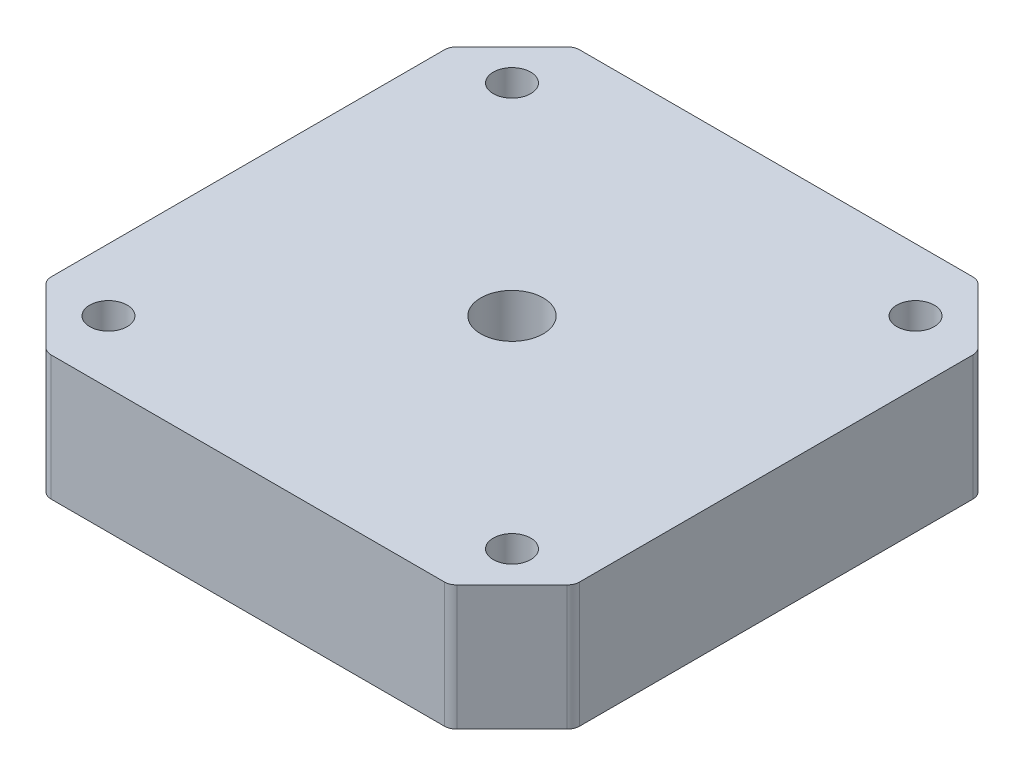
ISO-10303-21;
HEADER;
FILE_DESCRIPTION(('STEP AP214'),'2;1');
FILE_NAME('part.step','',(''),(''),'','','');
FILE_SCHEMA(('AUTOMOTIVE_DESIGN { 1 0 10303 214 1 1 1 1 }'));
ENDSEC;
DATA;
#1=APPLICATION_CONTEXT('core data for automotive mechanical design processes');
#2=APPLICATION_PROTOCOL_DEFINITION('international standard','automotive_design',2000,#1);
#3=PRODUCT_CONTEXT('',#1,'mechanical');
#4=PRODUCT('Part','Part','',(#3));
#5=PRODUCT_RELATED_PRODUCT_CATEGORY('part','',(#4));
#6=PRODUCT_DEFINITION_FORMATION('','',#4);
#7=PRODUCT_DEFINITION_CONTEXT('part definition',#1,'design');
#8=PRODUCT_DEFINITION('design','',#6,#7);
#9=PRODUCT_DEFINITION_SHAPE('','',#8);
#10=(LENGTH_UNIT() NAMED_UNIT(*) SI_UNIT(.MILLI.,.METRE.));
#11=(NAMED_UNIT(*) PLANE_ANGLE_UNIT() SI_UNIT($,.RADIAN.));
#12=(NAMED_UNIT(*) SI_UNIT($,.STERADIAN.) SOLID_ANGLE_UNIT());
#13=UNCERTAINTY_MEASURE_WITH_UNIT(LENGTH_MEASURE(1.E-05),#10,'distance_accuracy_value','');
#14=(GEOMETRIC_REPRESENTATION_CONTEXT(3) GLOBAL_UNCERTAINTY_ASSIGNED_CONTEXT((#13)) GLOBAL_UNIT_ASSIGNED_CONTEXT((#10,
#11,#12)) REPRESENTATION_CONTEXT('',''));
#15=CARTESIAN_POINT('',(0.,0.,0.));
#16=DIRECTION('',(0.,0.,1.));
#17=DIRECTION('',(1.,0.,0.));
#18=AXIS2_PLACEMENT_3D('',#15,#16,#17);
#19=CARTESIAN_POINT('',(1.,10.,-36.8857864376268));
#20=DIRECTION('',(0.,-1.,0.));
#21=DIRECTION('',(0.,0.,-1.));
#22=AXIS2_PLACEMENT_3D('',#19,#20,#21);
#23=CYLINDRICAL_SURFACE('',#22,1.);
#24=DIRECTION('',(0.,1.,0.));
#25=VECTOR('',#24,1.);
#26=CARTESIAN_POINT('',(0.292893218813445,10.,-37.5928932188133));
#27=LINE('',#26,#25);
#28=CARTESIAN_POINT('',(0.292893218813452,0.,-37.5928932188133));
#29=VERTEX_POINT('',#28);
#30=CARTESIAN_POINT('',(0.292893218813452,10.,-37.5928932188133));
#31=VERTEX_POINT('',#30);
#32=EDGE_CURVE('E244',#29,#31,#27,.T.);
#33=ORIENTED_EDGE('',*,*,#32,.F.);
#34=CARTESIAN_POINT('',(1.,0.,-36.8857864376268));
#35=DIRECTION('',(0.,1.,0.));
#36=DIRECTION('',(0.,0.,1.));
#37=AXIS2_PLACEMENT_3D('',#34,#35,#36);
#38=CIRCLE('',#37,1.);
#39=CARTESIAN_POINT('',(0.,0.,-36.8857864376268));
#40=VERTEX_POINT('',#39);
#41=EDGE_CURVE('E42',#40,#29,#38,.F.);
#42=ORIENTED_EDGE('',*,*,#41,.F.);
#43=DIRECTION('',(0.,1.,0.));
#44=VECTOR('',#43,1.);
#45=CARTESIAN_POINT('',(0.,10.,-36.8857864376268));
#46=LINE('',#45,#44);
#47=CARTESIAN_POINT('',(0.,10.,-36.8857864376268));
#48=VERTEX_POINT('',#47);
#49=EDGE_CURVE('E166',#48,#40,#46,.F.);
#50=ORIENTED_EDGE('',*,*,#49,.F.);
#51=CARTESIAN_POINT('',(1.,10.,-36.8857864376268));
#52=DIRECTION('',(0.,1.,0.));
#53=DIRECTION('',(0.,0.,1.));
#54=AXIS2_PLACEMENT_3D('',#51,#52,#53);
#55=CIRCLE('',#54,1.);
#56=EDGE_CURVE('E11',#31,#48,#55,.T.);
#57=ORIENTED_EDGE('',*,*,#56,.F.);
#58=EDGE_LOOP('',(#33,#42,#50,#57));
#59=FACE_BOUND('',#58,.T.);
#60=ADVANCED_FACE('F35',(#59),#23,.T.);
#61=CARTESIAN_POINT('',(5.41421356237311,10.,-41.3));
#62=DIRECTION('',(0.,-1.,0.));
#63=DIRECTION('',(0.,0.,-1.));
#64=AXIS2_PLACEMENT_3D('',#61,#62,#63);
#65=CYLINDRICAL_SURFACE('',#64,1.);
#66=DIRECTION('',(0.,1.,0.));
#67=VECTOR('',#66,1.);
#68=CARTESIAN_POINT('',(5.41421356237311,10.,-42.3));
#69=LINE('',#68,#67);
#70=CARTESIAN_POINT('',(5.41421356237311,0.,-42.3));
#71=VERTEX_POINT('',#70);
#72=CARTESIAN_POINT('',(5.41421356237311,10.,-42.3));
#73=VERTEX_POINT('',#72);
#74=EDGE_CURVE('E234',#71,#73,#69,.T.);
#75=ORIENTED_EDGE('',*,*,#74,.F.);
#76=CARTESIAN_POINT('',(5.41421356237311,0.,-41.3));
#77=DIRECTION('',(0.,1.,0.));
#78=DIRECTION('',(0.,0.,1.));
#79=AXIS2_PLACEMENT_3D('',#76,#77,#78);
#80=CIRCLE('',#79,1.);
#81=CARTESIAN_POINT('',(4.70710678118655,0.,-42.0071067811865));
#82=VERTEX_POINT('',#81);
#83=EDGE_CURVE('E240',#82,#71,#80,.F.);
#84=ORIENTED_EDGE('',*,*,#83,.F.);
#85=DIRECTION('',(0.,1.,0.));
#86=VECTOR('',#85,1.);
#87=CARTESIAN_POINT('',(4.70710678118655,10.,-42.0071067811865));
#88=LINE('',#87,#86);
#89=CARTESIAN_POINT('',(4.70710678118655,10.,-42.0071067811865));
#90=VERTEX_POINT('',#89);
#91=EDGE_CURVE('E237',#90,#82,#88,.F.);
#92=ORIENTED_EDGE('',*,*,#91,.F.);
#93=CARTESIAN_POINT('',(5.41421356237311,10.,-41.3));
#94=DIRECTION('',(0.,1.,0.));
#95=DIRECTION('',(0.,0.,1.));
#96=AXIS2_PLACEMENT_3D('',#93,#94,#95);
#97=CIRCLE('',#96,1.);
#98=EDGE_CURVE('E242',#73,#90,#97,.T.);
#99=ORIENTED_EDGE('',*,*,#98,.F.);
#100=EDGE_LOOP('',(#75,#84,#92,#99));
#101=FACE_BOUND('',#100,.T.);
#102=ADVANCED_FACE('F255',(#101),#65,.T.);
#103=CARTESIAN_POINT('',(36.8857864376269,10.,-41.3));
#104=DIRECTION('',(0.,1.,0.));
#105=DIRECTION('',(0.,0.,1.));
#106=AXIS2_PLACEMENT_3D('',#103,#104,#105);
#107=CYLINDRICAL_SURFACE('',#106,1.);
#108=DIRECTION('',(0.,1.,0.));
#109=VECTOR('',#108,1.);
#110=CARTESIAN_POINT('',(37.5928932188135,10.,-42.0071067811865));
#111=LINE('',#110,#109);
#112=CARTESIAN_POINT('',(37.5928932188135,0.,-42.0071067811865));
#113=VERTEX_POINT('',#112);
#114=CARTESIAN_POINT('',(37.5928932188135,10.,-42.0071067811865));
#115=VERTEX_POINT('',#114);
#116=EDGE_CURVE('E223',#113,#115,#111,.T.);
#117=ORIENTED_EDGE('',*,*,#116,.F.);
#118=CARTESIAN_POINT('',(36.8857864376269,0.,-41.3));
#119=DIRECTION('',(0.,1.,0.));
#120=DIRECTION('',(0.,0.,1.));
#121=AXIS2_PLACEMENT_3D('',#118,#119,#120);
#122=CIRCLE('',#121,1.);
#123=CARTESIAN_POINT('',(36.8857864376269,0.,-42.3));
#124=VERTEX_POINT('',#123);
#125=EDGE_CURVE('E229',#124,#113,#122,.F.);
#126=ORIENTED_EDGE('',*,*,#125,.F.);
#127=DIRECTION('',(0.,1.,0.));
#128=VECTOR('',#127,1.);
#129=CARTESIAN_POINT('',(36.8857864376269,10.,-42.3));
#130=LINE('',#129,#128);
#131=CARTESIAN_POINT('',(36.8857864376269,10.,-42.3));
#132=VERTEX_POINT('',#131);
#133=EDGE_CURVE('E226',#132,#124,#130,.F.);
#134=ORIENTED_EDGE('',*,*,#133,.F.);
#135=CARTESIAN_POINT('',(36.8857864376269,10.,-41.3));
#136=DIRECTION('',(0.,1.,0.));
#137=DIRECTION('',(0.,0.,1.));
#138=AXIS2_PLACEMENT_3D('',#135,#136,#137);
#139=CIRCLE('',#138,1.);
#140=EDGE_CURVE('E231',#115,#132,#139,.T.);
#141=ORIENTED_EDGE('',*,*,#140,.F.);
#142=EDGE_LOOP('',(#117,#126,#134,#141));
#143=FACE_BOUND('',#142,.T.);
#144=ADVANCED_FACE('F263',(#143),#107,.T.);
#145=CARTESIAN_POINT('',(41.3,10.,-36.885786437627));
#146=DIRECTION('',(0.,-1.,0.));
#147=DIRECTION('',(0.,0.,-1.));
#148=AXIS2_PLACEMENT_3D('',#145,#146,#147);
#149=CYLINDRICAL_SURFACE('',#148,1.);
#150=DIRECTION('',(0.,1.,0.));
#151=VECTOR('',#150,1.);
#152=CARTESIAN_POINT('',(42.3,10.,-36.885786437627));
#153=LINE('',#152,#151);
#154=CARTESIAN_POINT('',(42.3,0.,-36.885786437627));
#155=VERTEX_POINT('',#154);
#156=CARTESIAN_POINT('',(42.3,10.,-36.885786437627));
#157=VERTEX_POINT('',#156);
#158=EDGE_CURVE('E212',#155,#157,#153,.T.);
#159=ORIENTED_EDGE('',*,*,#158,.F.);
#160=CARTESIAN_POINT('',(41.3,0.,-36.885786437627));
#161=DIRECTION('',(0.,1.,0.));
#162=DIRECTION('',(0.,0.,1.));
#163=AXIS2_PLACEMENT_3D('',#160,#161,#162);
#164=CIRCLE('',#163,1.);
#165=CARTESIAN_POINT('',(42.0071067811865,0.,-37.5928932188136));
#166=VERTEX_POINT('',#165);
#167=EDGE_CURVE('E218',#166,#155,#164,.F.);
#168=ORIENTED_EDGE('',*,*,#167,.F.);
#169=DIRECTION('',(0.,1.,0.));
#170=VECTOR('',#169,1.);
#171=CARTESIAN_POINT('',(42.0071067811865,10.,-37.5928932188136));
#172=LINE('',#171,#170);
#173=CARTESIAN_POINT('',(42.0071067811865,10.,-37.5928932188136));
#174=VERTEX_POINT('',#173);
#175=EDGE_CURVE('E215',#174,#166,#172,.F.);
#176=ORIENTED_EDGE('',*,*,#175,.F.);
#177=CARTESIAN_POINT('',(41.3,10.,-36.885786437627));
#178=DIRECTION('',(0.,1.,0.));
#179=DIRECTION('',(0.,0.,1.));
#180=AXIS2_PLACEMENT_3D('',#177,#178,#179);
#181=CIRCLE('',#180,1.);
#182=EDGE_CURVE('E220',#157,#174,#181,.T.);
#183=ORIENTED_EDGE('',*,*,#182,.F.);
#184=EDGE_LOOP('',(#159,#168,#176,#183));
#185=FACE_BOUND('',#184,.T.);
#186=ADVANCED_FACE('F368',(#185),#149,.T.);
#187=CARTESIAN_POINT('',(41.3,10.,-5.41421356237309));
#188=DIRECTION('',(0.,-1.,0.));
#189=DIRECTION('',(0.,0.,-1.));
#190=AXIS2_PLACEMENT_3D('',#187,#188,#189);
#191=CYLINDRICAL_SURFACE('',#190,1.);
#192=DIRECTION('',(0.,1.,0.));
#193=VECTOR('',#192,1.);
#194=CARTESIAN_POINT('',(42.0071067811866,10.,-4.70710678118655));
#195=LINE('',#194,#193);
#196=CARTESIAN_POINT('',(42.0071067811866,0.,-4.70710678118655));
#197=VERTEX_POINT('',#196);
#198=CARTESIAN_POINT('',(42.0071067811866,10.,-4.70710678118655));
#199=VERTEX_POINT('',#198);
#200=EDGE_CURVE('E202',#197,#199,#195,.T.);
#201=ORIENTED_EDGE('',*,*,#200,.F.);
#202=CARTESIAN_POINT('',(41.3,0.,-5.41421356237309));
#203=DIRECTION('',(0.,1.,0.));
#204=DIRECTION('',(0.,0.,1.));
#205=AXIS2_PLACEMENT_3D('',#202,#203,#204);
#206=CIRCLE('',#205,1.);
#207=CARTESIAN_POINT('',(42.3,0.,-5.41421356237309));
#208=VERTEX_POINT('',#207);
#209=EDGE_CURVE('E208',#208,#197,#206,.F.);
#210=ORIENTED_EDGE('',*,*,#209,.F.);
#211=DIRECTION('',(0.,1.,0.));
#212=VECTOR('',#211,1.);
#213=CARTESIAN_POINT('',(42.3,10.,-5.41421356237309));
#214=LINE('',#213,#212);
#215=CARTESIAN_POINT('',(42.3,10.,-5.41421356237309));
#216=VERTEX_POINT('',#215);
#217=EDGE_CURVE('E205',#216,#208,#214,.F.);
#218=ORIENTED_EDGE('',*,*,#217,.F.);
#219=CARTESIAN_POINT('',(41.3,10.,-5.41421356237309));
#220=DIRECTION('',(0.,1.,0.));
#221=DIRECTION('',(0.,0.,1.));
#222=AXIS2_PLACEMENT_3D('',#219,#220,#221);
#223=CIRCLE('',#222,1.);
#224=EDGE_CURVE('E210',#199,#216,#223,.T.);
#225=ORIENTED_EDGE('',*,*,#224,.F.);
#226=EDGE_LOOP('',(#201,#210,#218,#225));
#227=FACE_BOUND('',#226,.T.);
#228=ADVANCED_FACE('F373',(#227),#191,.T.);
#229=CARTESIAN_POINT('',(36.885786437627,10.,-1.));
#230=DIRECTION('',(0.,-1.,0.));
#231=DIRECTION('',(0.,0.,-1.));
#232=AXIS2_PLACEMENT_3D('',#229,#230,#231);
#233=CYLINDRICAL_SURFACE('',#232,1.);
#234=DIRECTION('',(0.,1.,0.));
#235=VECTOR('',#234,1.);
#236=CARTESIAN_POINT('',(36.885786437627,10.,0.));
#237=LINE('',#236,#235);
#238=CARTESIAN_POINT('',(36.885786437627,0.,0.));
#239=VERTEX_POINT('',#238);
#240=CARTESIAN_POINT('',(36.885786437627,10.,0.));
#241=VERTEX_POINT('',#240);
#242=EDGE_CURVE('E191',#239,#241,#237,.T.);
#243=ORIENTED_EDGE('',*,*,#242,.F.);
#244=CARTESIAN_POINT('',(36.885786437627,0.,-1.));
#245=DIRECTION('',(0.,1.,0.));
#246=DIRECTION('',(0.,0.,1.));
#247=AXIS2_PLACEMENT_3D('',#244,#245,#246);
#248=CIRCLE('',#247,1.);
#249=CARTESIAN_POINT('',(37.5928932188135,0.,-0.292893218813456));
#250=VERTEX_POINT('',#249);
#251=EDGE_CURVE('E197',#250,#239,#248,.F.);
#252=ORIENTED_EDGE('',*,*,#251,.F.);
#253=DIRECTION('',(0.,1.,0.));
#254=VECTOR('',#253,1.);
#255=CARTESIAN_POINT('',(37.5928932188135,10.,-0.292893218813459));
#256=LINE('',#255,#254);
#257=CARTESIAN_POINT('',(37.5928932188135,10.,-0.292893218813456));
#258=VERTEX_POINT('',#257);
#259=EDGE_CURVE('E194',#258,#250,#256,.F.);
#260=ORIENTED_EDGE('',*,*,#259,.F.);
#261=CARTESIAN_POINT('',(36.885786437627,10.,-1.));
#262=DIRECTION('',(0.,1.,0.));
#263=DIRECTION('',(0.,0.,1.));
#264=AXIS2_PLACEMENT_3D('',#261,#262,#263);
#265=CIRCLE('',#264,1.);
#266=EDGE_CURVE('E199',#241,#258,#265,.T.);
#267=ORIENTED_EDGE('',*,*,#266,.F.);
#268=EDGE_LOOP('',(#243,#252,#260,#267));
#269=FACE_BOUND('',#268,.T.);
#270=ADVANCED_FACE('F377',(#269),#233,.T.);
#271=CARTESIAN_POINT('',(5.41421356237321,10.,-1.));
#272=DIRECTION('',(0.,1.,0.));
#273=DIRECTION('',(0.,0.,1.));
#274=AXIS2_PLACEMENT_3D('',#271,#272,#273);
#275=CYLINDRICAL_SURFACE('',#274,1.);
#276=DIRECTION('',(0.,1.,0.));
#277=VECTOR('',#276,1.);
#278=CARTESIAN_POINT('',(4.70710678118667,10.,-0.292893218813444));
#279=LINE('',#278,#277);
#280=CARTESIAN_POINT('',(4.70710678118667,0.,-0.292893218813444));
#281=VERTEX_POINT('',#280);
#282=CARTESIAN_POINT('',(4.70710678118667,10.,-0.292893218813444));
#283=VERTEX_POINT('',#282);
#284=EDGE_CURVE('E181',#281,#283,#279,.T.);
#285=ORIENTED_EDGE('',*,*,#284,.F.);
#286=CARTESIAN_POINT('',(5.41421356237321,0.,-1.));
#287=DIRECTION('',(0.,1.,0.));
#288=DIRECTION('',(0.,0.,1.));
#289=AXIS2_PLACEMENT_3D('',#286,#287,#288);
#290=CIRCLE('',#289,1.);
#291=CARTESIAN_POINT('',(5.41421356237321,0.,0.));
#292=VERTEX_POINT('',#291);
#293=EDGE_CURVE('E187',#292,#281,#290,.F.);
#294=ORIENTED_EDGE('',*,*,#293,.F.);
#295=DIRECTION('',(0.,1.,0.));
#296=VECTOR('',#295,1.);
#297=CARTESIAN_POINT('',(5.41421356237321,10.,0.));
#298=LINE('',#297,#296);
#299=CARTESIAN_POINT('',(5.41421356237321,10.,0.));
#300=VERTEX_POINT('',#299);
#301=EDGE_CURVE('E184',#300,#292,#298,.F.);
#302=ORIENTED_EDGE('',*,*,#301,.F.);
#303=CARTESIAN_POINT('',(5.41421356237321,10.,-1.));
#304=DIRECTION('',(0.,1.,0.));
#305=DIRECTION('',(0.,0.,1.));
#306=AXIS2_PLACEMENT_3D('',#303,#304,#305);
#307=CIRCLE('',#306,1.);
#308=EDGE_CURVE('E189',#283,#300,#307,.T.);
#309=ORIENTED_EDGE('',*,*,#308,.F.);
#310=EDGE_LOOP('',(#285,#294,#302,#309));
#311=FACE_BOUND('',#310,.T.);
#312=ADVANCED_FACE('F381',(#311),#275,.T.);
#313=CARTESIAN_POINT('',(1.,10.,-5.4142135623731));
#314=DIRECTION('',(0.,-1.,0.));
#315=DIRECTION('',(0.,0.,-1.));
#316=AXIS2_PLACEMENT_3D('',#313,#314,#315);
#317=CYLINDRICAL_SURFACE('',#316,1.);
#318=DIRECTION('',(0.,1.,0.));
#319=VECTOR('',#318,1.);
#320=CARTESIAN_POINT('',(0.,10.,-5.4142135623731));
#321=LINE('',#320,#319);
#322=CARTESIAN_POINT('',(0.,0.,-5.4142135623731));
#323=VERTEX_POINT('',#322);
#324=CARTESIAN_POINT('',(0.,10.,-5.4142135623731));
#325=VERTEX_POINT('',#324);
#326=EDGE_CURVE('E159',#323,#325,#321,.T.);
#327=ORIENTED_EDGE('',*,*,#326,.F.);
#328=CARTESIAN_POINT('',(1.,0.,-5.4142135623731));
#329=DIRECTION('',(0.,1.,0.));
#330=DIRECTION('',(0.,0.,1.));
#331=AXIS2_PLACEMENT_3D('',#328,#329,#330);
#332=CIRCLE('',#331,1.);
#333=CARTESIAN_POINT('',(0.292893218813461,0.,-4.70710678118655));
#334=VERTEX_POINT('',#333);
#335=EDGE_CURVE('E145',#334,#323,#332,.F.);
#336=ORIENTED_EDGE('',*,*,#335,.F.);
#337=DIRECTION('',(0.,1.,0.));
#338=VECTOR('',#337,1.);
#339=CARTESIAN_POINT('',(0.292893218813461,10.,-4.70710678118655));
#340=LINE('',#339,#338);
#341=CARTESIAN_POINT('',(0.292893218813461,10.,-4.70710678118655));
#342=VERTEX_POINT('',#341);
#343=EDGE_CURVE('E156',#342,#334,#340,.F.);
#344=ORIENTED_EDGE('',*,*,#343,.F.);
#345=CARTESIAN_POINT('',(1.,10.,-5.4142135623731));
#346=DIRECTION('',(0.,1.,0.));
#347=DIRECTION('',(0.,0.,1.));
#348=AXIS2_PLACEMENT_3D('',#345,#346,#347);
#349=CIRCLE('',#348,1.);
#350=EDGE_CURVE('E155',#325,#342,#349,.T.);
#351=ORIENTED_EDGE('',*,*,#350,.F.);
#352=EDGE_LOOP('',(#327,#336,#344,#351));
#353=FACE_BOUND('',#352,.T.);
#354=ADVANCED_FACE('F160',(#353),#317,.T.);
#355=CARTESIAN_POINT('',(18.6500000000004,10.,18.65));
#356=DIRECTION('',(0.707106781186553,0.,0.707106781186542));
#357=DIRECTION('',(0.707106781186542,0.,-0.707106781186553));
#358=AXIS2_PLACEMENT_3D('',#355,#356,#357);
#359=PLANE('',#358);
#360=DIRECTION('',(-0.707106781186542,0.,0.707106781186553));
#361=VECTOR('',#360,1.);
#362=CARTESIAN_POINT('',(18.6500000000004,0.,18.65));
#363=LINE('',#362,#361);
#364=EDGE_CURVE('E279',#197,#250,#363,.T.);
#365=ORIENTED_EDGE('',*,*,#364,.F.);
#366=ORIENTED_EDGE('',*,*,#200,.T.);
#367=DIRECTION('',(-0.707106781186542,0.,0.707106781186553));
#368=VECTOR('',#367,1.);
#369=CARTESIAN_POINT('',(18.6500000000004,10.,18.65));
#370=LINE('',#369,#368);
#371=EDGE_CURVE('E308',#199,#258,#370,.T.);
#372=ORIENTED_EDGE('',*,*,#371,.T.);
#373=ORIENTED_EDGE('',*,*,#259,.T.);
#374=EDGE_LOOP('',(#365,#366,#372,#373));
#375=FACE_BOUND('',#374,.T.);
#376=ADVANCED_FACE('F388',(#375),#359,.T.);
#377=CARTESIAN_POINT('',(42.3,10.,0.));
#378=DIRECTION('',(-1.,0.,0.));
#379=DIRECTION('',(0.,0.,1.));
#380=AXIS2_PLACEMENT_3D('',#377,#378,#379);
#381=PLANE('',#380);
#382=DIRECTION('',(0.,0.,-1.));
#383=VECTOR('',#382,1.);
#384=CARTESIAN_POINT('',(42.3,0.,0.));
#385=LINE('',#384,#383);
#386=EDGE_CURVE('E276',#208,#155,#385,.T.);
#387=ORIENTED_EDGE('',*,*,#386,.T.);
#388=ORIENTED_EDGE('',*,*,#158,.T.);
#389=DIRECTION('',(0.,0.,-1.));
#390=VECTOR('',#389,1.);
#391=CARTESIAN_POINT('',(42.3,10.,0.));
#392=LINE('',#391,#390);
#393=EDGE_CURVE('E305',#216,#157,#392,.T.);
#394=ORIENTED_EDGE('',*,*,#393,.F.);
#395=ORIENTED_EDGE('',*,*,#217,.T.);
#396=EDGE_LOOP('',(#387,#388,#394,#395));
#397=FACE_BOUND('',#396,.T.);
#398=ADVANCED_FACE('F402',(#397),#381,.F.);
#399=CARTESIAN_POINT('',(39.7999999999996,10.,-39.8000000000005));
#400=DIRECTION('',(0.70710678118654,0.,-0.707106781186555));
#401=DIRECTION('',(-0.707106781186555,0.,-0.70710678118654));
#402=AXIS2_PLACEMENT_3D('',#399,#400,#401);
#403=PLANE('',#402);
#404=DIRECTION('',(0.707106781186555,0.,0.70710678118654));
#405=VECTOR('',#404,1.);
#406=CARTESIAN_POINT('',(39.7999999999996,0.,-39.8000000000005));
#407=LINE('',#406,#405);
#408=EDGE_CURVE('E260',#113,#166,#407,.T.);
#409=ORIENTED_EDGE('',*,*,#408,.F.);
#410=ORIENTED_EDGE('',*,*,#116,.T.);
#411=DIRECTION('',(0.707106781186555,0.,0.70710678118654));
#412=VECTOR('',#411,1.);
#413=CARTESIAN_POINT('',(39.7999999999996,10.,-39.8000000000005));
#414=LINE('',#413,#412);
#415=EDGE_CURVE('E268',#115,#174,#414,.T.);
#416=ORIENTED_EDGE('',*,*,#415,.T.);
#417=ORIENTED_EDGE('',*,*,#175,.T.);
#418=EDGE_LOOP('',(#409,#410,#416,#417));
#419=FACE_BOUND('',#418,.T.);
#420=ADVANCED_FACE('F273',(#419),#403,.T.);
#421=CARTESIAN_POINT('',(0.,10.,-42.3));
#422=DIRECTION('',(0.,0.,-1.));
#423=DIRECTION('',(-1.,0.,0.));
#424=AXIS2_PLACEMENT_3D('',#421,#422,#423);
#425=PLANE('',#424);
#426=DIRECTION('',(1.,0.,0.));
#427=VECTOR('',#426,1.);
#428=CARTESIAN_POINT('',(0.,0.,-42.3));
#429=LINE('',#428,#427);
#430=EDGE_CURVE('E172',#71,#124,#429,.T.);
#431=ORIENTED_EDGE('',*,*,#430,.F.);
#432=ORIENTED_EDGE('',*,*,#74,.T.);
#433=DIRECTION('',(1.,0.,0.));
#434=VECTOR('',#433,1.);
#435=CARTESIAN_POINT('',(0.,10.,-42.3));
#436=LINE('',#435,#434);
#437=EDGE_CURVE('E267',#73,#132,#436,.T.);
#438=ORIENTED_EDGE('',*,*,#437,.T.);
#439=ORIENTED_EDGE('',*,*,#133,.T.);
#440=EDGE_LOOP('',(#431,#432,#438,#439));
#441=FACE_BOUND('',#440,.T.);
#442=ADVANCED_FACE('F265',(#441),#425,.T.);
#443=CARTESIAN_POINT('',(-18.6499999999999,10.,-18.6499999999996));
#444=DIRECTION('',(0.707106781186554,0.,0.707106781186541));
#445=DIRECTION('',(0.707106781186541,0.,-0.707106781186554));
#446=AXIS2_PLACEMENT_3D('',#443,#444,#445);
#447=PLANE('',#446);
#448=DIRECTION('',(-0.707106781186541,0.,0.707106781186554));
#449=VECTOR('',#448,1.);
#450=CARTESIAN_POINT('',(-18.6499999999999,0.,-18.6499999999996));
#451=LINE('',#450,#449);
#452=EDGE_CURVE('E167',#82,#29,#451,.T.);
#453=ORIENTED_EDGE('',*,*,#452,.T.);
#454=ORIENTED_EDGE('',*,*,#32,.T.);
#455=DIRECTION('',(-0.707106781186541,0.,0.707106781186554));
#456=VECTOR('',#455,1.);
#457=CARTESIAN_POINT('',(-18.6499999999999,10.,-18.6499999999996));
#458=LINE('',#457,#456);
#459=EDGE_CURVE('E252',#90,#31,#458,.T.);
#460=ORIENTED_EDGE('',*,*,#459,.F.);
#461=ORIENTED_EDGE('',*,*,#91,.T.);
#462=EDGE_LOOP('',(#453,#454,#460,#461));
#463=FACE_BOUND('',#462,.T.);
#464=ADVANCED_FACE('F250',(#463),#447,.F.);
#465=CARTESIAN_POINT('',(0.,10.,0.));
#466=DIRECTION('',(-1.,0.,0.));
#467=DIRECTION('',(0.,0.,1.));
#468=AXIS2_PLACEMENT_3D('',#465,#466,#467);
#469=PLANE('',#468);
#470=DIRECTION('',(0.,0.,-1.));
#471=VECTOR('',#470,1.);
#472=CARTESIAN_POINT('',(0.,10.,0.));
#473=LINE('',#472,#471);
#474=EDGE_CURVE('E301',#325,#48,#473,.T.);
#475=ORIENTED_EDGE('',*,*,#474,.T.);
#476=ORIENTED_EDGE('',*,*,#49,.T.);
#477=DIRECTION('',(0.,0.,-1.));
#478=VECTOR('',#477,1.);
#479=CARTESIAN_POINT('',(0.,0.,0.));
#480=LINE('',#479,#478);
#481=EDGE_CURVE('E149',#323,#40,#480,.T.);
#482=ORIENTED_EDGE('',*,*,#481,.F.);
#483=ORIENTED_EDGE('',*,*,#326,.T.);
#484=EDGE_LOOP('',(#475,#476,#482,#483));
#485=FACE_BOUND('',#484,.T.);
#486=ADVANCED_FACE('F165',(#485),#469,.T.);
#487=CARTESIAN_POINT('',(2.5,10.,-2.50000000000006));
#488=DIRECTION('',(0.707106781186539,0.,-0.707106781186556));
#489=DIRECTION('',(-0.707106781186556,0.,-0.707106781186539));
#490=AXIS2_PLACEMENT_3D('',#487,#488,#489);
#491=PLANE('',#490);
#492=DIRECTION('',(0.707106781186556,0.,0.707106781186539));
#493=VECTOR('',#492,1.);
#494=CARTESIAN_POINT('',(2.5,0.,-2.50000000000006));
#495=LINE('',#494,#493);
#496=EDGE_CURVE('E151',#334,#281,#495,.T.);
#497=ORIENTED_EDGE('',*,*,#496,.T.);
#498=ORIENTED_EDGE('',*,*,#284,.T.);
#499=DIRECTION('',(0.707106781186556,0.,0.707106781186539));
#500=VECTOR('',#499,1.);
#501=CARTESIAN_POINT('',(2.5,10.,-2.50000000000006));
#502=LINE('',#501,#500);
#503=EDGE_CURVE('E298',#342,#283,#502,.T.);
#504=ORIENTED_EDGE('',*,*,#503,.F.);
#505=ORIENTED_EDGE('',*,*,#343,.T.);
#506=EDGE_LOOP('',(#497,#498,#504,#505));
#507=FACE_BOUND('',#506,.T.);
#508=ADVANCED_FACE('F351',(#507),#491,.F.);
#509=CARTESIAN_POINT('',(5.,10.,-5.));
#510=DIRECTION('',(0.,-1.,0.));
#511=DIRECTION('',(0.,0.,-1.));
#512=AXIS2_PLACEMENT_3D('',#509,#510,#511);
#513=CYLINDRICAL_SURFACE('',#512,1.5);
#514=CARTESIAN_POINT('',(5.,10.,-5.));
#515=DIRECTION('',(0.,1.,0.));
#516=DIRECTION('',(0.,0.,1.));
#517=AXIS2_PLACEMENT_3D('',#514,#515,#516);
#518=CIRCLE('',#517,1.5);
#519=CARTESIAN_POINT('',(5.,10.,-3.5));
#520=VERTEX_POINT('',#519);
#521=EDGE_CURVE('E310',#520,#520,#518,.T.);
#522=ORIENTED_EDGE('',*,*,#521,.T.);
#523=EDGE_LOOP('',(#522));
#524=FACE_BOUND('',#523,.T.);
#525=CARTESIAN_POINT('',(5.,0.,-5.));
#526=DIRECTION('',(0.,1.,0.));
#527=DIRECTION('',(0.,0.,1.));
#528=AXIS2_PLACEMENT_3D('',#525,#526,#527);
#529=CIRCLE('',#528,1.5);
#530=CARTESIAN_POINT('',(5.,0.,-3.5));
#531=VERTEX_POINT('',#530);
#532=EDGE_CURVE('E283',#531,#531,#529,.T.);
#533=ORIENTED_EDGE('',*,*,#532,.F.);
#534=EDGE_LOOP('',(#533));
#535=FACE_BOUND('',#534,.T.);
#536=ADVANCED_FACE('F347',(#524,#535),#513,.F.);
#537=CARTESIAN_POINT('',(5.,10.,-37.3));
#538=DIRECTION('',(0.,-1.,0.));
#539=DIRECTION('',(0.,0.,-1.));
#540=AXIS2_PLACEMENT_3D('',#537,#538,#539);
#541=CYLINDRICAL_SURFACE('',#540,1.5);
#542=CARTESIAN_POINT('',(5.,10.,-37.3));
#543=DIRECTION('',(0.,1.,0.));
#544=DIRECTION('',(0.,0.,1.));
#545=AXIS2_PLACEMENT_3D('',#542,#543,#544);
#546=CIRCLE('',#545,1.5);
#547=CARTESIAN_POINT('',(5.,10.,-35.8));
#548=VERTEX_POINT('',#547);
#549=EDGE_CURVE('E313',#548,#548,#546,.T.);
#550=ORIENTED_EDGE('',*,*,#549,.T.);
#551=EDGE_LOOP('',(#550));
#552=FACE_BOUND('',#551,.T.);
#553=CARTESIAN_POINT('',(5.,0.,-37.3));
#554=DIRECTION('',(0.,1.,0.));
#555=DIRECTION('',(0.,0.,1.));
#556=AXIS2_PLACEMENT_3D('',#553,#554,#555);
#557=CIRCLE('',#556,1.5);
#558=CARTESIAN_POINT('',(5.,0.,-35.8));
#559=VERTEX_POINT('',#558);
#560=EDGE_CURVE('E286',#559,#559,#557,.T.);
#561=ORIENTED_EDGE('',*,*,#560,.F.);
#562=EDGE_LOOP('',(#561));
#563=FACE_BOUND('',#562,.T.);
#564=ADVANCED_FACE('F350',(#552,#563),#541,.F.);
#565=CARTESIAN_POINT('',(37.3,10.,-37.3));
#566=DIRECTION('',(0.,-1.,0.));
#567=DIRECTION('',(0.,0.,-1.));
#568=AXIS2_PLACEMENT_3D('',#565,#566,#567);
#569=CYLINDRICAL_SURFACE('',#568,1.5);
#570=CARTESIAN_POINT('',(37.3,10.,-37.3));
#571=DIRECTION('',(0.,1.,0.));
#572=DIRECTION('',(0.,0.,1.));
#573=AXIS2_PLACEMENT_3D('',#570,#571,#572);
#574=CIRCLE('',#573,1.5);
#575=CARTESIAN_POINT('',(37.3,10.,-35.8));
#576=VERTEX_POINT('',#575);
#577=EDGE_CURVE('E316',#576,#576,#574,.T.);
#578=ORIENTED_EDGE('',*,*,#577,.T.);
#579=EDGE_LOOP('',(#578));
#580=FACE_BOUND('',#579,.T.);
#581=CARTESIAN_POINT('',(37.3,0.,-37.3));
#582=DIRECTION('',(0.,1.,0.));
#583=DIRECTION('',(0.,0.,1.));
#584=AXIS2_PLACEMENT_3D('',#581,#582,#583);
#585=CIRCLE('',#584,1.5);
#586=CARTESIAN_POINT('',(37.3,0.,-35.8));
#587=VERTEX_POINT('',#586);
#588=EDGE_CURVE('E289',#587,#587,#585,.T.);
#589=ORIENTED_EDGE('',*,*,#588,.F.);
#590=EDGE_LOOP('',(#589));
#591=FACE_BOUND('',#590,.T.);
#592=ADVANCED_FACE('F392',(#580,#591),#569,.F.);
#593=CARTESIAN_POINT('',(37.3,10.,-5.));
#594=DIRECTION('',(0.,-1.,0.));
#595=DIRECTION('',(0.,0.,-1.));
#596=AXIS2_PLACEMENT_3D('',#593,#594,#595);
#597=CYLINDRICAL_SURFACE('',#596,1.5);
#598=CARTESIAN_POINT('',(37.3,10.,-5.));
#599=DIRECTION('',(0.,1.,0.));
#600=DIRECTION('',(0.,0.,1.));
#601=AXIS2_PLACEMENT_3D('',#598,#599,#600);
#602=CIRCLE('',#601,1.5);
#603=CARTESIAN_POINT('',(37.3,10.,-3.5));
#604=VERTEX_POINT('',#603);
#605=EDGE_CURVE('E177',#604,#604,#602,.T.);
#606=ORIENTED_EDGE('',*,*,#605,.T.);
#607=EDGE_LOOP('',(#606));
#608=FACE_BOUND('',#607,.T.);
#609=CARTESIAN_POINT('',(37.3,0.,-5.));
#610=DIRECTION('',(0.,1.,0.));
#611=DIRECTION('',(0.,0.,1.));
#612=AXIS2_PLACEMENT_3D('',#609,#610,#611);
#613=CIRCLE('',#612,1.5);
#614=CARTESIAN_POINT('',(37.3,0.,-3.5));
#615=VERTEX_POINT('',#614);
#616=EDGE_CURVE('E292',#615,#615,#613,.T.);
#617=ORIENTED_EDGE('',*,*,#616,.F.);
#618=EDGE_LOOP('',(#617));
#619=FACE_BOUND('',#618,.T.);
#620=ADVANCED_FACE('F389',(#608,#619),#597,.F.);
#621=CARTESIAN_POINT('',(0.,10.,0.));
#622=DIRECTION('',(0.,0.,-1.));
#623=DIRECTION('',(-1.,0.,0.));
#624=AXIS2_PLACEMENT_3D('',#621,#622,#623);
#625=PLANE('',#624);
#626=DIRECTION('',(1.,0.,0.));
#627=VECTOR('',#626,1.);
#628=CARTESIAN_POINT('',(0.,0.,0.));
#629=LINE('',#628,#627);
#630=EDGE_CURVE('E169',#292,#239,#629,.T.);
#631=ORIENTED_EDGE('',*,*,#630,.T.);
#632=ORIENTED_EDGE('',*,*,#242,.T.);
#633=DIRECTION('',(1.,0.,0.));
#634=VECTOR('',#633,1.);
#635=CARTESIAN_POINT('',(0.,10.,0.));
#636=LINE('',#635,#634);
#637=EDGE_CURVE('E163',#300,#241,#636,.T.);
#638=ORIENTED_EDGE('',*,*,#637,.F.);
#639=ORIENTED_EDGE('',*,*,#301,.T.);
#640=EDGE_LOOP('',(#631,#632,#638,#639));
#641=FACE_BOUND('',#640,.T.);
#642=ADVANCED_FACE('F337',(#641),#625,.F.);
#643=CARTESIAN_POINT('',(0.,10.,0.));
#644=DIRECTION('',(0.,1.,0.));
#645=DIRECTION('',(0.,0.,1.));
#646=AXIS2_PLACEMENT_3D('',#643,#644,#645);
#647=PLANE('',#646);
#648=CARTESIAN_POINT('',(21.1500000000001,10.,-21.1499999999999));
#649=DIRECTION('',(0.,1.,0.));
#650=DIRECTION('',(0.,0.,1.));
#651=AXIS2_PLACEMENT_3D('',#648,#649,#650);
#652=CIRCLE('',#651,2.5);
#653=CARTESIAN_POINT('',(21.1500000000001,10.,-18.65));
#654=VERTEX_POINT('',#653);
#655=EDGE_CURVE('E321',#654,#654,#652,.T.);
#656=ORIENTED_EDGE('',*,*,#655,.F.);
#657=EDGE_LOOP('',(#656));
#658=FACE_BOUND('',#657,.T.);
#659=ORIENTED_EDGE('',*,*,#605,.F.);
#660=EDGE_LOOP('',(#659));
#661=FACE_BOUND('',#660,.T.);
#662=ORIENTED_EDGE('',*,*,#577,.F.);
#663=EDGE_LOOP('',(#662));
#664=FACE_BOUND('',#663,.T.);
#665=ORIENTED_EDGE('',*,*,#549,.F.);
#666=EDGE_LOOP('',(#665));
#667=FACE_BOUND('',#666,.T.);
#668=ORIENTED_EDGE('',*,*,#521,.F.);
#669=EDGE_LOOP('',(#668));
#670=FACE_BOUND('',#669,.T.);
#671=ORIENTED_EDGE('',*,*,#459,.T.);
#672=ORIENTED_EDGE('',*,*,#56,.T.);
#673=ORIENTED_EDGE('',*,*,#474,.F.);
#674=ORIENTED_EDGE('',*,*,#350,.T.);
#675=ORIENTED_EDGE('',*,*,#503,.T.);
#676=ORIENTED_EDGE('',*,*,#308,.T.);
#677=ORIENTED_EDGE('',*,*,#637,.T.);
#678=ORIENTED_EDGE('',*,*,#266,.T.);
#679=ORIENTED_EDGE('',*,*,#371,.F.);
#680=ORIENTED_EDGE('',*,*,#224,.T.);
#681=ORIENTED_EDGE('',*,*,#393,.T.);
#682=ORIENTED_EDGE('',*,*,#182,.T.);
#683=ORIENTED_EDGE('',*,*,#415,.F.);
#684=ORIENTED_EDGE('',*,*,#140,.T.);
#685=ORIENTED_EDGE('',*,*,#437,.F.);
#686=ORIENTED_EDGE('',*,*,#98,.T.);
#687=EDGE_LOOP('',(#671,#672,#673,#674,#675,#676,#677,#678,#679,#680,#681,#682,#683,#684,#685,#686));
#688=FACE_BOUND('',#687,.T.);
#689=ADVANCED_FACE('F271',(#658,#661,#664,#667,#670,#688),#647,.T.);
#690=CARTESIAN_POINT('',(0.,0.,0.));
#691=DIRECTION('',(0.,1.,0.));
#692=DIRECTION('',(0.,0.,1.));
#693=AXIS2_PLACEMENT_3D('',#690,#691,#692);
#694=PLANE('',#693);
#695=CARTESIAN_POINT('',(21.1500000000001,0.,-21.1499999999999));
#696=DIRECTION('',(0.,1.,0.));
#697=DIRECTION('',(0.,0.,1.));
#698=AXIS2_PLACEMENT_3D('',#695,#696,#697);
#699=CIRCLE('',#698,2.5);
#700=CARTESIAN_POINT('',(21.1500000000001,0.,-18.65));
#701=VERTEX_POINT('',#700);
#702=EDGE_CURVE('E295',#701,#701,#699,.T.);
#703=ORIENTED_EDGE('',*,*,#702,.T.);
#704=EDGE_LOOP('',(#703));
#705=FACE_BOUND('',#704,.T.);
#706=ORIENTED_EDGE('',*,*,#616,.T.);
#707=EDGE_LOOP('',(#706));
#708=FACE_BOUND('',#707,.T.);
#709=ORIENTED_EDGE('',*,*,#588,.T.);
#710=EDGE_LOOP('',(#709));
#711=FACE_BOUND('',#710,.T.);
#712=ORIENTED_EDGE('',*,*,#560,.T.);
#713=EDGE_LOOP('',(#712));
#714=FACE_BOUND('',#713,.T.);
#715=ORIENTED_EDGE('',*,*,#532,.T.);
#716=EDGE_LOOP('',(#715));
#717=FACE_BOUND('',#716,.T.);
#718=ORIENTED_EDGE('',*,*,#481,.T.);
#719=ORIENTED_EDGE('',*,*,#41,.T.);
#720=ORIENTED_EDGE('',*,*,#452,.F.);
#721=ORIENTED_EDGE('',*,*,#83,.T.);
#722=ORIENTED_EDGE('',*,*,#430,.T.);
#723=ORIENTED_EDGE('',*,*,#125,.T.);
#724=ORIENTED_EDGE('',*,*,#408,.T.);
#725=ORIENTED_EDGE('',*,*,#167,.T.);
#726=ORIENTED_EDGE('',*,*,#386,.F.);
#727=ORIENTED_EDGE('',*,*,#209,.T.);
#728=ORIENTED_EDGE('',*,*,#364,.T.);
#729=ORIENTED_EDGE('',*,*,#251,.T.);
#730=ORIENTED_EDGE('',*,*,#630,.F.);
#731=ORIENTED_EDGE('',*,*,#293,.T.);
#732=ORIENTED_EDGE('',*,*,#496,.F.);
#733=ORIENTED_EDGE('',*,*,#335,.T.);
#734=EDGE_LOOP('',(#718,#719,#720,#721,#722,#723,#724,#725,#726,#727,#728,#729,#730,#731,#732,#733));
#735=FACE_BOUND('',#734,.T.);
#736=ADVANCED_FACE('F147',(#705,#708,#711,#714,#717,#735),#694,.F.);
#737=CARTESIAN_POINT('',(21.1500000000001,0.,-21.1499999999999));
#738=DIRECTION('',(0.,1.,0.));
#739=DIRECTION('',(0.,0.,1.));
#740=AXIS2_PLACEMENT_3D('',#737,#738,#739);
#741=CYLINDRICAL_SURFACE('',#740,2.5);
#742=ORIENTED_EDGE('',*,*,#702,.F.);
#743=EDGE_LOOP('',(#742));
#744=FACE_BOUND('',#743,.T.);
#745=ORIENTED_EDGE('',*,*,#655,.T.);
#746=EDGE_LOOP('',(#745));
#747=FACE_BOUND('',#746,.T.);
#748=ADVANCED_FACE('F329',(#744,#747),#741,.F.);
#749=CLOSED_SHELL('',(#60,#102,#144,#186,#228,#270,#312,#354,#376,#398,#420,#442,#464,#486,#508,
#536,#564,#592,#620,#642,#689,#736,#748));
#750=MANIFOLD_SOLID_BREP('B2',#749);
#751=ADVANCED_BREP_SHAPE_REPRESENTATION('',(#18,#750),#14);
#752=SHAPE_DEFINITION_REPRESENTATION(#9,#751);
ENDSEC;
END-ISO-10303-21;
